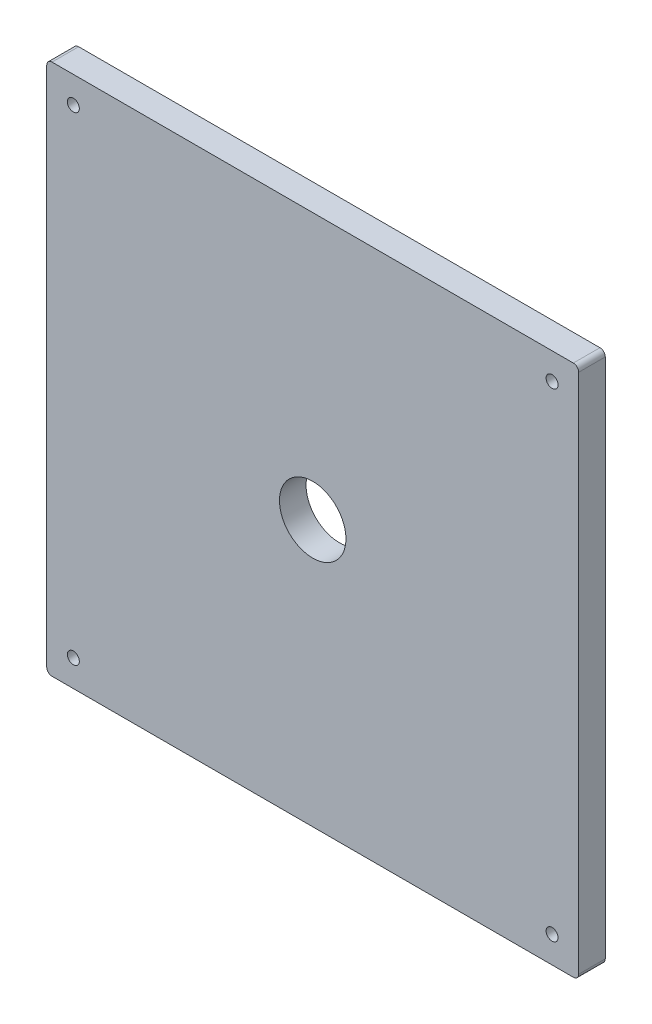
ISO-10303-21;
HEADER;
FILE_DESCRIPTION(('STEP AP214'),'2;1');
FILE_NAME('part.step','',(''),(''),'','','');
FILE_SCHEMA(('AUTOMOTIVE_DESIGN { 1 0 10303 214 1 1 1 1 }'));
ENDSEC;
DATA;
#1=APPLICATION_CONTEXT('core data for automotive mechanical design processes');
#2=APPLICATION_PROTOCOL_DEFINITION('international standard','automotive_design',2000,#1);
#3=PRODUCT_CONTEXT('',#1,'mechanical');
#4=PRODUCT('Part','Part','',(#3));
#5=PRODUCT_RELATED_PRODUCT_CATEGORY('part','',(#4));
#6=PRODUCT_DEFINITION_FORMATION('','',#4);
#7=PRODUCT_DEFINITION_CONTEXT('part definition',#1,'design');
#8=PRODUCT_DEFINITION('design','',#6,#7);
#9=PRODUCT_DEFINITION_SHAPE('','',#8);
#10=(LENGTH_UNIT() NAMED_UNIT(*) SI_UNIT(.MILLI.,.METRE.));
#11=(NAMED_UNIT(*) PLANE_ANGLE_UNIT() SI_UNIT($,.RADIAN.));
#12=(NAMED_UNIT(*) SI_UNIT($,.STERADIAN.) SOLID_ANGLE_UNIT());
#13=UNCERTAINTY_MEASURE_WITH_UNIT(LENGTH_MEASURE(1.E-05),#10,'distance_accuracy_value','');
#14=(GEOMETRIC_REPRESENTATION_CONTEXT(3) GLOBAL_UNCERTAINTY_ASSIGNED_CONTEXT((#13)) GLOBAL_UNIT_ASSIGNED_CONTEXT((#10,
#11,#12)) REPRESENTATION_CONTEXT('',''));
#15=CARTESIAN_POINT('',(0.,0.,0.));
#16=DIRECTION('',(0.,0.,1.));
#17=DIRECTION('',(1.,0.,0.));
#18=AXIS2_PLACEMENT_3D('',#15,#16,#17);
#19=CARTESIAN_POINT('',(-98.,-98.,0.));
#20=DIRECTION('',(0.,0.,-1.));
#21=DIRECTION('',(-1.,0.,0.));
#22=AXIS2_PLACEMENT_3D('',#19,#20,#21);
#23=PLANE('',#22);
#24=CARTESIAN_POINT('',(90.,90.0000000000004,0.));
#25=DIRECTION('',(0.,0.,-1.));
#26=DIRECTION('',(-1.,0.,0.));
#27=AXIS2_PLACEMENT_3D('',#24,#25,#26);
#28=CIRCLE('',#27,4.49999999999999);
#29=CARTESIAN_POINT('',(85.5,90.0000000000004,0.));
#30=VERTEX_POINT('',#29);
#31=EDGE_CURVE('E242',#30,#30,#28,.T.);
#32=ORIENTED_EDGE('',*,*,#31,.F.);
#33=EDGE_LOOP('',(#32));
#34=FACE_BOUND('',#33,.T.);
#35=CARTESIAN_POINT('',(-90.,90.0000000000004,0.));
#36=DIRECTION('',(0.,0.,-1.));
#37=DIRECTION('',(-1.,0.,0.));
#38=AXIS2_PLACEMENT_3D('',#35,#36,#37);
#39=CIRCLE('',#38,4.49999999999999);
#40=CARTESIAN_POINT('',(-94.5,90.0000000000004,0.));
#41=VERTEX_POINT('',#40);
#42=EDGE_CURVE('E230',#41,#41,#39,.T.);
#43=ORIENTED_EDGE('',*,*,#42,.F.);
#44=EDGE_LOOP('',(#43));
#45=FACE_BOUND('',#44,.T.);
#46=CARTESIAN_POINT('',(-90.,-89.9999999999996,0.));
#47=DIRECTION('',(0.,0.,-1.));
#48=DIRECTION('',(-1.,0.,0.));
#49=AXIS2_PLACEMENT_3D('',#46,#47,#48);
#50=CIRCLE('',#49,4.49999999999999);
#51=CARTESIAN_POINT('',(-94.5,-89.9999999999996,0.));
#52=VERTEX_POINT('',#51);
#53=EDGE_CURVE('E218',#52,#52,#50,.T.);
#54=ORIENTED_EDGE('',*,*,#53,.F.);
#55=EDGE_LOOP('',(#54));
#56=FACE_BOUND('',#55,.T.);
#57=CARTESIAN_POINT('',(90.,-89.9999999999996,0.));
#58=DIRECTION('',(0.,0.,-1.));
#59=DIRECTION('',(-1.,0.,0.));
#60=AXIS2_PLACEMENT_3D('',#57,#58,#59);
#61=CIRCLE('',#60,4.49999999999999);
#62=CARTESIAN_POINT('',(85.5,-89.9999999999996,0.));
#63=VERTEX_POINT('',#62);
#64=EDGE_CURVE('E206',#63,#63,#61,.T.);
#65=ORIENTED_EDGE('',*,*,#64,.F.);
#66=EDGE_LOOP('',(#65));
#67=FACE_BOUND('',#66,.T.);
#68=CARTESIAN_POINT('',(0.,0.,0.));
#69=DIRECTION('',(0.,0.,1.));
#70=DIRECTION('',(1.,0.,0.));
#71=AXIS2_PLACEMENT_3D('',#68,#69,#70);
#72=CIRCLE('',#71,12.5);
#73=CARTESIAN_POINT('',(12.5,0.,0.));
#74=VERTEX_POINT('',#73);
#75=EDGE_CURVE('E180',#74,#74,#72,.T.);
#76=ORIENTED_EDGE('',*,*,#75,.T.);
#77=EDGE_LOOP('',(#76));
#78=FACE_BOUND('',#77,.T.);
#79=CARTESIAN_POINT('',(-98.,-98.,0.));
#80=DIRECTION('',(0.,0.,1.));
#81=DIRECTION('',(-1.,0.,0.));
#82=AXIS2_PLACEMENT_3D('',#79,#80,#81);
#83=CIRCLE('',#82,2.);
#84=CARTESIAN_POINT('',(-100.,-98.,0.));
#85=VERTEX_POINT('',#84);
#86=CARTESIAN_POINT('',(-98.,-100.,0.));
#87=VERTEX_POINT('',#86);
#88=EDGE_CURVE('E133',#85,#87,#83,.T.);
#89=ORIENTED_EDGE('',*,*,#88,.F.);
#90=DIRECTION('',(0.,-1.,0.));
#91=VECTOR('',#90,1.);
#92=CARTESIAN_POINT('',(-100.,-98.,0.));
#93=LINE('',#92,#91);
#94=CARTESIAN_POINT('',(-100.,98.,0.));
#95=VERTEX_POINT('',#94);
#96=EDGE_CURVE('E87',#95,#85,#93,.T.);
#97=ORIENTED_EDGE('',*,*,#96,.F.);
#98=CARTESIAN_POINT('',(-98.,98.,0.));
#99=DIRECTION('',(0.,0.,1.));
#100=DIRECTION('',(1.,0.,0.));
#101=AXIS2_PLACEMENT_3D('',#98,#99,#100);
#102=CIRCLE('',#101,1.99999999999999);
#103=CARTESIAN_POINT('',(-98.,100.,0.));
#104=VERTEX_POINT('',#103);
#105=EDGE_CURVE('E81',#104,#95,#102,.T.);
#106=ORIENTED_EDGE('',*,*,#105,.F.);
#107=DIRECTION('',(-1.,0.,0.));
#108=VECTOR('',#107,1.);
#109=CARTESIAN_POINT('',(-98.,100.,0.));
#110=LINE('',#109,#108);
#111=CARTESIAN_POINT('',(98.,100.,0.));
#112=VERTEX_POINT('',#111);
#113=EDGE_CURVE('E123',#112,#104,#110,.T.);
#114=ORIENTED_EDGE('',*,*,#113,.F.);
#115=CARTESIAN_POINT('',(98.,98.,0.));
#116=DIRECTION('',(0.,0.,1.));
#117=DIRECTION('',(1.,0.,0.));
#118=AXIS2_PLACEMENT_3D('',#115,#116,#117);
#119=CIRCLE('',#118,1.99999999999999);
#120=CARTESIAN_POINT('',(100.,98.,0.));
#121=VERTEX_POINT('',#120);
#122=EDGE_CURVE('E143',#121,#112,#119,.T.);
#123=ORIENTED_EDGE('',*,*,#122,.F.);
#124=DIRECTION('',(0.,1.,0.));
#125=VECTOR('',#124,1.);
#126=CARTESIAN_POINT('',(100.,-98.,0.));
#127=LINE('',#126,#125);
#128=CARTESIAN_POINT('',(100.,-98.,0.));
#129=VERTEX_POINT('',#128);
#130=EDGE_CURVE('E141',#129,#121,#127,.T.);
#131=ORIENTED_EDGE('',*,*,#130,.F.);
#132=CARTESIAN_POINT('',(98.,-98.,0.));
#133=DIRECTION('',(0.,0.,1.));
#134=DIRECTION('',(1.,0.,0.));
#135=AXIS2_PLACEMENT_3D('',#132,#133,#134);
#136=CIRCLE('',#135,2.);
#137=CARTESIAN_POINT('',(98.,-100.,0.));
#138=VERTEX_POINT('',#137);
#139=EDGE_CURVE('E139',#138,#129,#136,.T.);
#140=ORIENTED_EDGE('',*,*,#139,.F.);
#141=DIRECTION('',(1.,0.,0.));
#142=VECTOR('',#141,1.);
#143=CARTESIAN_POINT('',(-98.,-100.,0.));
#144=LINE('',#143,#142);
#145=EDGE_CURVE('E136',#87,#138,#144,.T.);
#146=ORIENTED_EDGE('',*,*,#145,.F.);
#147=EDGE_LOOP('',(#89,#97,#106,#114,#123,#131,#140,#146));
#148=FACE_BOUND('',#147,.T.);
#149=ADVANCED_FACE('F35',(#34,#45,#56,#67,#78,#148),#23,.T.);
#150=CARTESIAN_POINT('',(-98.,-98.,10.));
#151=DIRECTION('',(0.,0.,-1.));
#152=DIRECTION('',(-1.,0.,0.));
#153=AXIS2_PLACEMENT_3D('',#150,#151,#152);
#154=PLANE('',#153);
#155=CARTESIAN_POINT('',(-90.,90.0000000000004,10.));
#156=DIRECTION('',(0.,0.,1.));
#157=DIRECTION('',(1.,0.,0.));
#158=AXIS2_PLACEMENT_3D('',#155,#156,#157);
#159=CIRCLE('',#158,2.24999999999999);
#160=CARTESIAN_POINT('',(-87.75,90.0000000000004,10.));
#161=VERTEX_POINT('',#160);
#162=EDGE_CURVE('E194',#161,#161,#159,.T.);
#163=ORIENTED_EDGE('',*,*,#162,.F.);
#164=EDGE_LOOP('',(#163));
#165=FACE_BOUND('',#164,.T.);
#166=CARTESIAN_POINT('',(-90.,-89.9999999999996,10.));
#167=DIRECTION('',(0.,0.,1.));
#168=DIRECTION('',(1.,0.,0.));
#169=AXIS2_PLACEMENT_3D('',#166,#167,#168);
#170=CIRCLE('',#169,2.24999999999999);
#171=CARTESIAN_POINT('',(-87.75,-89.9999999999996,10.));
#172=VERTEX_POINT('',#171);
#173=EDGE_CURVE('E191',#172,#172,#170,.T.);
#174=ORIENTED_EDGE('',*,*,#173,.F.);
#175=EDGE_LOOP('',(#174));
#176=FACE_BOUND('',#175,.T.);
#177=CARTESIAN_POINT('',(90.,-89.9999999999996,10.));
#178=DIRECTION('',(0.,0.,1.));
#179=DIRECTION('',(1.,0.,0.));
#180=AXIS2_PLACEMENT_3D('',#177,#178,#179);
#181=CIRCLE('',#180,2.24999999999999);
#182=CARTESIAN_POINT('',(92.25,-89.9999999999996,10.));
#183=VERTEX_POINT('',#182);
#184=EDGE_CURVE('E188',#183,#183,#181,.T.);
#185=ORIENTED_EDGE('',*,*,#184,.F.);
#186=EDGE_LOOP('',(#185));
#187=FACE_BOUND('',#186,.T.);
#188=CARTESIAN_POINT('',(90.,90.0000000000004,10.));
#189=DIRECTION('',(0.,0.,1.));
#190=DIRECTION('',(1.,0.,0.));
#191=AXIS2_PLACEMENT_3D('',#188,#189,#190);
#192=CIRCLE('',#191,2.24999999999999);
#193=CARTESIAN_POINT('',(92.25,90.0000000000004,10.));
#194=VERTEX_POINT('',#193);
#195=EDGE_CURVE('E183',#194,#194,#192,.T.);
#196=ORIENTED_EDGE('',*,*,#195,.F.);
#197=EDGE_LOOP('',(#196));
#198=FACE_BOUND('',#197,.T.);
#199=CARTESIAN_POINT('',(-98.,-98.,10.));
#200=DIRECTION('',(0.,0.,1.));
#201=DIRECTION('',(-1.,0.,0.));
#202=AXIS2_PLACEMENT_3D('',#199,#200,#201);
#203=CIRCLE('',#202,2.);
#204=CARTESIAN_POINT('',(-100.,-98.,10.));
#205=VERTEX_POINT('',#204);
#206=CARTESIAN_POINT('',(-98.,-100.,10.));
#207=VERTEX_POINT('',#206);
#208=EDGE_CURVE('E148',#205,#207,#203,.T.);
#209=ORIENTED_EDGE('',*,*,#208,.T.);
#210=DIRECTION('',(1.,0.,0.));
#211=VECTOR('',#210,1.);
#212=CARTESIAN_POINT('',(-98.,-100.,10.));
#213=LINE('',#212,#211);
#214=CARTESIAN_POINT('',(98.,-100.,10.));
#215=VERTEX_POINT('',#214);
#216=EDGE_CURVE('E95',#207,#215,#213,.T.);
#217=ORIENTED_EDGE('',*,*,#216,.T.);
#218=CARTESIAN_POINT('',(98.,-98.,10.));
#219=DIRECTION('',(0.,0.,1.));
#220=DIRECTION('',(1.,0.,0.));
#221=AXIS2_PLACEMENT_3D('',#218,#219,#220);
#222=CIRCLE('',#221,2.);
#223=CARTESIAN_POINT('',(100.,-98.,10.));
#224=VERTEX_POINT('',#223);
#225=EDGE_CURVE('E163',#215,#224,#222,.T.);
#226=ORIENTED_EDGE('',*,*,#225,.T.);
#227=DIRECTION('',(0.,1.,0.));
#228=VECTOR('',#227,1.);
#229=CARTESIAN_POINT('',(100.,-98.,10.));
#230=LINE('',#229,#228);
#231=CARTESIAN_POINT('',(100.,98.,10.));
#232=VERTEX_POINT('',#231);
#233=EDGE_CURVE('E174',#224,#232,#230,.T.);
#234=ORIENTED_EDGE('',*,*,#233,.T.);
#235=CARTESIAN_POINT('',(98.,98.,10.));
#236=DIRECTION('',(0.,0.,1.));
#237=DIRECTION('',(1.,0.,0.));
#238=AXIS2_PLACEMENT_3D('',#235,#236,#237);
#239=CIRCLE('',#238,1.99999999999999);
#240=CARTESIAN_POINT('',(98.,100.,10.));
#241=VERTEX_POINT('',#240);
#242=EDGE_CURVE('E115',#232,#241,#239,.T.);
#243=ORIENTED_EDGE('',*,*,#242,.T.);
#244=DIRECTION('',(-1.,0.,0.));
#245=VECTOR('',#244,1.);
#246=CARTESIAN_POINT('',(-98.,100.,10.));
#247=LINE('',#246,#245);
#248=CARTESIAN_POINT('',(-98.,100.,10.));
#249=VERTEX_POINT('',#248);
#250=EDGE_CURVE('E108',#241,#249,#247,.T.);
#251=ORIENTED_EDGE('',*,*,#250,.T.);
#252=CARTESIAN_POINT('',(-98.,98.,10.));
#253=DIRECTION('',(0.,0.,1.));
#254=DIRECTION('',(1.,0.,0.));
#255=AXIS2_PLACEMENT_3D('',#252,#253,#254);
#256=CIRCLE('',#255,1.99999999999999);
#257=CARTESIAN_POINT('',(-100.,98.,10.));
#258=VERTEX_POINT('',#257);
#259=EDGE_CURVE('E113',#249,#258,#256,.T.);
#260=ORIENTED_EDGE('',*,*,#259,.T.);
#261=DIRECTION('',(0.,-1.,0.));
#262=VECTOR('',#261,1.);
#263=CARTESIAN_POINT('',(-100.,-98.,10.));
#264=LINE('',#263,#262);
#265=EDGE_CURVE('E52',#258,#205,#264,.T.);
#266=ORIENTED_EDGE('',*,*,#265,.T.);
#267=EDGE_LOOP('',(#209,#217,#226,#234,#243,#251,#260,#266));
#268=FACE_BOUND('',#267,.T.);
#269=CARTESIAN_POINT('',(0.,0.,10.));
#270=DIRECTION('',(0.,0.,1.));
#271=DIRECTION('',(1.,0.,0.));
#272=AXIS2_PLACEMENT_3D('',#269,#270,#271);
#273=CIRCLE('',#272,12.5);
#274=CARTESIAN_POINT('',(12.5,0.,10.));
#275=VERTEX_POINT('',#274);
#276=EDGE_CURVE('E137',#275,#275,#273,.T.);
#277=ORIENTED_EDGE('',*,*,#276,.F.);
#278=EDGE_LOOP('',(#277));
#279=FACE_BOUND('',#278,.T.);
#280=ADVANCED_FACE('F110',(#165,#176,#187,#198,#268,#279),#154,.F.);
#281=CARTESIAN_POINT('',(-98.,-98.,10.));
#282=DIRECTION('',(0.,0.,-1.));
#283=DIRECTION('',(-1.,0.,0.));
#284=AXIS2_PLACEMENT_3D('',#281,#282,#283);
#285=CYLINDRICAL_SURFACE('',#284,2.);
#286=ORIENTED_EDGE('',*,*,#88,.T.);
#287=DIRECTION('',(0.,0.,-1.));
#288=VECTOR('',#287,1.);
#289=CARTESIAN_POINT('',(-98.,-100.,10.));
#290=LINE('',#289,#288);
#291=EDGE_CURVE('E11',#207,#87,#290,.T.);
#292=ORIENTED_EDGE('',*,*,#291,.F.);
#293=ORIENTED_EDGE('',*,*,#208,.F.);
#294=DIRECTION('',(0.,0.,-1.));
#295=VECTOR('',#294,1.);
#296=CARTESIAN_POINT('',(-100.,-98.,10.));
#297=LINE('',#296,#295);
#298=EDGE_CURVE('E129',#205,#85,#297,.T.);
#299=ORIENTED_EDGE('',*,*,#298,.T.);
#300=EDGE_LOOP('',(#286,#292,#293,#299));
#301=FACE_BOUND('',#300,.T.);
#302=ADVANCED_FACE('F37',(#301),#285,.T.);
#303=CARTESIAN_POINT('',(-98.,-100.,10.));
#304=DIRECTION('',(0.,1.,0.));
#305=DIRECTION('',(0.,0.,1.));
#306=AXIS2_PLACEMENT_3D('',#303,#304,#305);
#307=PLANE('',#306);
#308=ORIENTED_EDGE('',*,*,#145,.T.);
#309=DIRECTION('',(0.,0.,-1.));
#310=VECTOR('',#309,1.);
#311=CARTESIAN_POINT('',(98.,-100.,10.));
#312=LINE('',#311,#310);
#313=EDGE_CURVE('E44',#215,#138,#312,.T.);
#314=ORIENTED_EDGE('',*,*,#313,.F.);
#315=ORIENTED_EDGE('',*,*,#216,.F.);
#316=ORIENTED_EDGE('',*,*,#291,.T.);
#317=EDGE_LOOP('',(#308,#314,#315,#316));
#318=FACE_BOUND('',#317,.T.);
#319=ADVANCED_FACE('F288',(#318),#307,.F.);
#320=CARTESIAN_POINT('',(98.,-98.,10.));
#321=DIRECTION('',(0.,0.,-1.));
#322=DIRECTION('',(-1.,0.,0.));
#323=AXIS2_PLACEMENT_3D('',#320,#321,#322);
#324=CYLINDRICAL_SURFACE('',#323,2.);
#325=ORIENTED_EDGE('',*,*,#139,.T.);
#326=DIRECTION('',(0.,0.,-1.));
#327=VECTOR('',#326,1.);
#328=CARTESIAN_POINT('',(100.,-98.,10.));
#329=LINE('',#328,#327);
#330=EDGE_CURVE('E155',#224,#129,#329,.T.);
#331=ORIENTED_EDGE('',*,*,#330,.F.);
#332=ORIENTED_EDGE('',*,*,#225,.F.);
#333=ORIENTED_EDGE('',*,*,#313,.T.);
#334=EDGE_LOOP('',(#325,#331,#332,#333));
#335=FACE_BOUND('',#334,.T.);
#336=ADVANCED_FACE('F161',(#335),#324,.T.);
#337=CARTESIAN_POINT('',(100.,-98.,10.));
#338=DIRECTION('',(-1.,0.,0.));
#339=DIRECTION('',(0.,0.,1.));
#340=AXIS2_PLACEMENT_3D('',#337,#338,#339);
#341=PLANE('',#340);
#342=ORIENTED_EDGE('',*,*,#130,.T.);
#343=DIRECTION('',(0.,0.,-1.));
#344=VECTOR('',#343,1.);
#345=CARTESIAN_POINT('',(100.,98.,10.));
#346=LINE('',#345,#344);
#347=EDGE_CURVE('E152',#232,#121,#346,.T.);
#348=ORIENTED_EDGE('',*,*,#347,.F.);
#349=ORIENTED_EDGE('',*,*,#233,.F.);
#350=ORIENTED_EDGE('',*,*,#330,.T.);
#351=EDGE_LOOP('',(#342,#348,#349,#350));
#352=FACE_BOUND('',#351,.T.);
#353=ADVANCED_FACE('F170',(#352),#341,.F.);
#354=CARTESIAN_POINT('',(98.,98.,10.));
#355=DIRECTION('',(0.,0.,-1.));
#356=DIRECTION('',(-1.,0.,0.));
#357=AXIS2_PLACEMENT_3D('',#354,#355,#356);
#358=CYLINDRICAL_SURFACE('',#357,1.99999999999999);
#359=ORIENTED_EDGE('',*,*,#122,.T.);
#360=DIRECTION('',(0.,0.,-1.));
#361=VECTOR('',#360,1.);
#362=CARTESIAN_POINT('',(98.,100.,10.));
#363=LINE('',#362,#361);
#364=EDGE_CURVE('E124',#241,#112,#363,.T.);
#365=ORIENTED_EDGE('',*,*,#364,.F.);
#366=ORIENTED_EDGE('',*,*,#242,.F.);
#367=ORIENTED_EDGE('',*,*,#347,.T.);
#368=EDGE_LOOP('',(#359,#365,#366,#367));
#369=FACE_BOUND('',#368,.T.);
#370=ADVANCED_FACE('F173',(#369),#358,.T.);
#371=CARTESIAN_POINT('',(-98.,100.,10.));
#372=DIRECTION('',(0.,-1.,0.));
#373=DIRECTION('',(0.,0.,-1.));
#374=AXIS2_PLACEMENT_3D('',#371,#372,#373);
#375=PLANE('',#374);
#376=ORIENTED_EDGE('',*,*,#113,.T.);
#377=DIRECTION('',(0.,0.,-1.));
#378=VECTOR('',#377,1.);
#379=CARTESIAN_POINT('',(-98.,100.,10.));
#380=LINE('',#379,#378);
#381=EDGE_CURVE('E120',#249,#104,#380,.T.);
#382=ORIENTED_EDGE('',*,*,#381,.F.);
#383=ORIENTED_EDGE('',*,*,#250,.F.);
#384=ORIENTED_EDGE('',*,*,#364,.T.);
#385=EDGE_LOOP('',(#376,#382,#383,#384));
#386=FACE_BOUND('',#385,.T.);
#387=ADVANCED_FACE('F121',(#386),#375,.F.);
#388=CARTESIAN_POINT('',(-98.,98.,10.));
#389=DIRECTION('',(0.,0.,-1.));
#390=DIRECTION('',(-1.,0.,0.));
#391=AXIS2_PLACEMENT_3D('',#388,#389,#390);
#392=CYLINDRICAL_SURFACE('',#391,1.99999999999999);
#393=ORIENTED_EDGE('',*,*,#105,.T.);
#394=DIRECTION('',(0.,0.,-1.));
#395=VECTOR('',#394,1.);
#396=CARTESIAN_POINT('',(-100.,98.,10.));
#397=LINE('',#396,#395);
#398=EDGE_CURVE('E125',#258,#95,#397,.T.);
#399=ORIENTED_EDGE('',*,*,#398,.F.);
#400=ORIENTED_EDGE('',*,*,#259,.F.);
#401=ORIENTED_EDGE('',*,*,#381,.T.);
#402=EDGE_LOOP('',(#393,#399,#400,#401));
#403=FACE_BOUND('',#402,.T.);
#404=ADVANCED_FACE('F127',(#403),#392,.T.);
#405=CARTESIAN_POINT('',(-100.,-98.,10.));
#406=DIRECTION('',(1.,0.,0.));
#407=DIRECTION('',(0.,0.,-1.));
#408=AXIS2_PLACEMENT_3D('',#405,#406,#407);
#409=PLANE('',#408);
#410=ORIENTED_EDGE('',*,*,#96,.T.);
#411=ORIENTED_EDGE('',*,*,#298,.F.);
#412=ORIENTED_EDGE('',*,*,#265,.F.);
#413=ORIENTED_EDGE('',*,*,#398,.T.);
#414=EDGE_LOOP('',(#410,#411,#412,#413));
#415=FACE_BOUND('',#414,.T.);
#416=ADVANCED_FACE('F262',(#415),#409,.F.);
#417=CARTESIAN_POINT('',(0.,0.,10.));
#418=DIRECTION('',(0.,0.,-1.));
#419=DIRECTION('',(-1.,0.,0.));
#420=AXIS2_PLACEMENT_3D('',#417,#418,#419);
#421=CYLINDRICAL_SURFACE('',#420,12.5);
#422=ORIENTED_EDGE('',*,*,#276,.T.);
#423=EDGE_LOOP('',(#422));
#424=FACE_BOUND('',#423,.T.);
#425=ORIENTED_EDGE('',*,*,#75,.F.);
#426=EDGE_LOOP('',(#425));
#427=FACE_BOUND('',#426,.T.);
#428=ADVANCED_FACE('F259',(#424,#427),#421,.F.);
#429=CARTESIAN_POINT('',(90.,90.0000000000004,10.));
#430=DIRECTION('',(0.,0.,1.));
#431=DIRECTION('',(1.,0.,0.));
#432=AXIS2_PLACEMENT_3D('',#429,#430,#431);
#433=CYLINDRICAL_SURFACE('',#432,2.25);
#434=CARTESIAN_POINT('',(90.,90.0000000000004,3.125));
#435=DIRECTION('',(0.,0.,-1.));
#436=DIRECTION('',(-1.,0.,0.));
#437=AXIS2_PLACEMENT_3D('',#434,#435,#436);
#438=CIRCLE('',#437,2.25);
#439=CARTESIAN_POINT('',(87.75,90.0000000000004,3.125));
#440=VERTEX_POINT('',#439);
#441=EDGE_CURVE('E233',#440,#440,#438,.T.);
#442=ORIENTED_EDGE('',*,*,#441,.T.);
#443=EDGE_LOOP('',(#442));
#444=FACE_BOUND('',#443,.T.);
#445=ORIENTED_EDGE('',*,*,#195,.T.);
#446=EDGE_LOOP('',(#445));
#447=FACE_BOUND('',#446,.T.);
#448=ADVANCED_FACE('F261',(#444,#447),#433,.F.);
#449=CARTESIAN_POINT('',(90.,-89.9999999999996,10.));
#450=DIRECTION('',(0.,0.,1.));
#451=DIRECTION('',(1.,0.,0.));
#452=AXIS2_PLACEMENT_3D('',#449,#450,#451);
#453=CYLINDRICAL_SURFACE('',#452,2.25);
#454=CARTESIAN_POINT('',(90.,-89.9999999999996,3.125));
#455=DIRECTION('',(0.,0.,-1.));
#456=DIRECTION('',(-1.,0.,0.));
#457=AXIS2_PLACEMENT_3D('',#454,#455,#456);
#458=CIRCLE('',#457,2.25);
#459=CARTESIAN_POINT('',(87.75,-89.9999999999996,3.125));
#460=VERTEX_POINT('',#459);
#461=EDGE_CURVE('E197',#460,#460,#458,.T.);
#462=ORIENTED_EDGE('',*,*,#461,.T.);
#463=EDGE_LOOP('',(#462));
#464=FACE_BOUND('',#463,.T.);
#465=ORIENTED_EDGE('',*,*,#184,.T.);
#466=EDGE_LOOP('',(#465));
#467=FACE_BOUND('',#466,.T.);
#468=ADVANCED_FACE('F270',(#464,#467),#453,.F.);
#469=CARTESIAN_POINT('',(-90.,-89.9999999999996,10.));
#470=DIRECTION('',(0.,0.,1.));
#471=DIRECTION('',(1.,0.,0.));
#472=AXIS2_PLACEMENT_3D('',#469,#470,#471);
#473=CYLINDRICAL_SURFACE('',#472,2.25);
#474=CARTESIAN_POINT('',(-90.,-89.9999999999996,3.125));
#475=DIRECTION('',(0.,0.,-1.));
#476=DIRECTION('',(-1.,0.,0.));
#477=AXIS2_PLACEMENT_3D('',#474,#475,#476);
#478=CIRCLE('',#477,2.25);
#479=CARTESIAN_POINT('',(-92.25,-89.9999999999996,3.125));
#480=VERTEX_POINT('',#479);
#481=EDGE_CURVE('E209',#480,#480,#478,.T.);
#482=ORIENTED_EDGE('',*,*,#481,.T.);
#483=EDGE_LOOP('',(#482));
#484=FACE_BOUND('',#483,.T.);
#485=ORIENTED_EDGE('',*,*,#173,.T.);
#486=EDGE_LOOP('',(#485));
#487=FACE_BOUND('',#486,.T.);
#488=ADVANCED_FACE('F324',(#484,#487),#473,.F.);
#489=CARTESIAN_POINT('',(-90.,90.0000000000004,10.));
#490=DIRECTION('',(0.,0.,1.));
#491=DIRECTION('',(1.,0.,0.));
#492=AXIS2_PLACEMENT_3D('',#489,#490,#491);
#493=CYLINDRICAL_SURFACE('',#492,2.25);
#494=CARTESIAN_POINT('',(-90.,90.0000000000004,3.125));
#495=DIRECTION('',(0.,0.,-1.));
#496=DIRECTION('',(-1.,0.,0.));
#497=AXIS2_PLACEMENT_3D('',#494,#495,#496);
#498=CIRCLE('',#497,2.25);
#499=CARTESIAN_POINT('',(-92.25,90.0000000000004,3.125));
#500=VERTEX_POINT('',#499);
#501=EDGE_CURVE('E221',#500,#500,#498,.T.);
#502=ORIENTED_EDGE('',*,*,#501,.T.);
#503=EDGE_LOOP('',(#502));
#504=FACE_BOUND('',#503,.T.);
#505=ORIENTED_EDGE('',*,*,#162,.T.);
#506=EDGE_LOOP('',(#505));
#507=FACE_BOUND('',#506,.T.);
#508=ADVANCED_FACE('F333',(#504,#507),#493,.F.);
#509=CARTESIAN_POINT('',(90.,-89.9999999999996,3.1));
#510=DIRECTION('',(0.,0.,-1.));
#511=DIRECTION('',(-1.,0.,0.));
#512=AXIS2_PLACEMENT_3D('',#509,#510,#511);
#513=CONICAL_SURFACE('',#512,2.275,0.785398163397448);
#514=ORIENTED_EDGE('',*,*,#461,.F.);
#515=EDGE_LOOP('',(#514));
#516=FACE_BOUND('',#515,.T.);
#517=CARTESIAN_POINT('',(90.,-89.9999999999996,3.1));
#518=DIRECTION('',(0.,0.,-1.));
#519=DIRECTION('',(-1.,0.,0.));
#520=AXIS2_PLACEMENT_3D('',#517,#518,#519);
#521=CIRCLE('',#520,2.275);
#522=CARTESIAN_POINT('',(87.725,-89.9999999999996,3.1));
#523=VERTEX_POINT('',#522);
#524=EDGE_CURVE('E200',#523,#523,#521,.T.);
#525=ORIENTED_EDGE('',*,*,#524,.T.);
#526=EDGE_LOOP('',(#525));
#527=FACE_BOUND('',#526,.T.);
#528=ADVANCED_FACE('F343',(#516,#527),#513,.F.);
#529=CARTESIAN_POINT('',(92.275,-89.9999999999996,3.1));
#530=DIRECTION('',(0.,0.,1.));
#531=DIRECTION('',(1.,0.,0.));
#532=AXIS2_PLACEMENT_3D('',#529,#530,#531);
#533=PLANE('',#532);
#534=ORIENTED_EDGE('',*,*,#524,.F.);
#535=EDGE_LOOP('',(#534));
#536=FACE_BOUND('',#535,.T.);
#537=CARTESIAN_POINT('',(90.,-89.9999999999996,3.1));
#538=DIRECTION('',(0.,0.,-1.));
#539=DIRECTION('',(-1.,0.,0.));
#540=AXIS2_PLACEMENT_3D('',#537,#538,#539);
#541=CIRCLE('',#540,4.49999999999999);
#542=CARTESIAN_POINT('',(85.5,-89.9999999999996,3.1));
#543=VERTEX_POINT('',#542);
#544=EDGE_CURVE('E203',#543,#543,#541,.T.);
#545=ORIENTED_EDGE('',*,*,#544,.T.);
#546=EDGE_LOOP('',(#545));
#547=FACE_BOUND('',#546,.T.);
#548=ADVANCED_FACE('F353',(#536,#547),#533,.F.);
#549=CARTESIAN_POINT('',(90.,-89.9999999999996,0.));
#550=DIRECTION('',(0.,0.,-1.));
#551=DIRECTION('',(-1.,0.,0.));
#552=AXIS2_PLACEMENT_3D('',#549,#550,#551);
#553=CYLINDRICAL_SURFACE('',#552,4.49999999999999);
#554=ORIENTED_EDGE('',*,*,#544,.F.);
#555=EDGE_LOOP('',(#554));
#556=FACE_BOUND('',#555,.T.);
#557=ORIENTED_EDGE('',*,*,#64,.T.);
#558=EDGE_LOOP('',(#557));
#559=FACE_BOUND('',#558,.T.);
#560=ADVANCED_FACE('F363',(#556,#559),#553,.F.);
#561=CARTESIAN_POINT('',(-90.,-89.9999999999996,3.1));
#562=DIRECTION('',(0.,0.,-1.));
#563=DIRECTION('',(-1.,0.,0.));
#564=AXIS2_PLACEMENT_3D('',#561,#562,#563);
#565=CONICAL_SURFACE('',#564,2.275,0.785398163397448);
#566=ORIENTED_EDGE('',*,*,#481,.F.);
#567=EDGE_LOOP('',(#566));
#568=FACE_BOUND('',#567,.T.);
#569=CARTESIAN_POINT('',(-90.,-89.9999999999996,3.1));
#570=DIRECTION('',(0.,0.,-1.));
#571=DIRECTION('',(-1.,0.,0.));
#572=AXIS2_PLACEMENT_3D('',#569,#570,#571);
#573=CIRCLE('',#572,2.275);
#574=CARTESIAN_POINT('',(-92.275,-89.9999999999996,3.1));
#575=VERTEX_POINT('',#574);
#576=EDGE_CURVE('E212',#575,#575,#573,.T.);
#577=ORIENTED_EDGE('',*,*,#576,.T.);
#578=EDGE_LOOP('',(#577));
#579=FACE_BOUND('',#578,.T.);
#580=ADVANCED_FACE('F373',(#568,#579),#565,.F.);
#581=CARTESIAN_POINT('',(-87.725,-89.9999999999996,3.1));
#582=DIRECTION('',(0.,0.,1.));
#583=DIRECTION('',(1.,0.,0.));
#584=AXIS2_PLACEMENT_3D('',#581,#582,#583);
#585=PLANE('',#584);
#586=ORIENTED_EDGE('',*,*,#576,.F.);
#587=EDGE_LOOP('',(#586));
#588=FACE_BOUND('',#587,.T.);
#589=CARTESIAN_POINT('',(-90.,-89.9999999999996,3.1));
#590=DIRECTION('',(0.,0.,-1.));
#591=DIRECTION('',(-1.,0.,0.));
#592=AXIS2_PLACEMENT_3D('',#589,#590,#591);
#593=CIRCLE('',#592,4.49999999999999);
#594=CARTESIAN_POINT('',(-94.5,-89.9999999999996,3.1));
#595=VERTEX_POINT('',#594);
#596=EDGE_CURVE('E215',#595,#595,#593,.T.);
#597=ORIENTED_EDGE('',*,*,#596,.T.);
#598=EDGE_LOOP('',(#597));
#599=FACE_BOUND('',#598,.T.);
#600=ADVANCED_FACE('F383',(#588,#599),#585,.F.);
#601=CARTESIAN_POINT('',(-90.,-89.9999999999996,0.));
#602=DIRECTION('',(0.,0.,-1.));
#603=DIRECTION('',(-1.,0.,0.));
#604=AXIS2_PLACEMENT_3D('',#601,#602,#603);
#605=CYLINDRICAL_SURFACE('',#604,4.49999999999999);
#606=ORIENTED_EDGE('',*,*,#596,.F.);
#607=EDGE_LOOP('',(#606));
#608=FACE_BOUND('',#607,.T.);
#609=ORIENTED_EDGE('',*,*,#53,.T.);
#610=EDGE_LOOP('',(#609));
#611=FACE_BOUND('',#610,.T.);
#612=ADVANCED_FACE('F393',(#608,#611),#605,.F.);
#613=CARTESIAN_POINT('',(-90.,90.0000000000004,3.1));
#614=DIRECTION('',(0.,0.,-1.));
#615=DIRECTION('',(-1.,0.,0.));
#616=AXIS2_PLACEMENT_3D('',#613,#614,#615);
#617=CONICAL_SURFACE('',#616,2.275,0.785398163397448);
#618=ORIENTED_EDGE('',*,*,#501,.F.);
#619=EDGE_LOOP('',(#618));
#620=FACE_BOUND('',#619,.T.);
#621=CARTESIAN_POINT('',(-90.,90.0000000000004,3.1));
#622=DIRECTION('',(0.,0.,-1.));
#623=DIRECTION('',(-1.,0.,0.));
#624=AXIS2_PLACEMENT_3D('',#621,#622,#623);
#625=CIRCLE('',#624,2.275);
#626=CARTESIAN_POINT('',(-92.275,90.0000000000004,3.1));
#627=VERTEX_POINT('',#626);
#628=EDGE_CURVE('E224',#627,#627,#625,.T.);
#629=ORIENTED_EDGE('',*,*,#628,.T.);
#630=EDGE_LOOP('',(#629));
#631=FACE_BOUND('',#630,.T.);
#632=ADVANCED_FACE('F403',(#620,#631),#617,.F.);
#633=CARTESIAN_POINT('',(-87.725,90.0000000000004,3.1));
#634=DIRECTION('',(0.,0.,1.));
#635=DIRECTION('',(1.,0.,0.));
#636=AXIS2_PLACEMENT_3D('',#633,#634,#635);
#637=PLANE('',#636);
#638=ORIENTED_EDGE('',*,*,#628,.F.);
#639=EDGE_LOOP('',(#638));
#640=FACE_BOUND('',#639,.T.);
#641=CARTESIAN_POINT('',(-90.,90.0000000000004,3.1));
#642=DIRECTION('',(0.,0.,-1.));
#643=DIRECTION('',(-1.,0.,0.));
#644=AXIS2_PLACEMENT_3D('',#641,#642,#643);
#645=CIRCLE('',#644,4.49999999999999);
#646=CARTESIAN_POINT('',(-94.5,90.0000000000004,3.1));
#647=VERTEX_POINT('',#646);
#648=EDGE_CURVE('E227',#647,#647,#645,.T.);
#649=ORIENTED_EDGE('',*,*,#648,.T.);
#650=EDGE_LOOP('',(#649));
#651=FACE_BOUND('',#650,.T.);
#652=ADVANCED_FACE('F413',(#640,#651),#637,.F.);
#653=CARTESIAN_POINT('',(-90.,90.0000000000004,0.));
#654=DIRECTION('',(0.,0.,-1.));
#655=DIRECTION('',(-1.,0.,0.));
#656=AXIS2_PLACEMENT_3D('',#653,#654,#655);
#657=CYLINDRICAL_SURFACE('',#656,4.49999999999999);
#658=ORIENTED_EDGE('',*,*,#648,.F.);
#659=EDGE_LOOP('',(#658));
#660=FACE_BOUND('',#659,.T.);
#661=ORIENTED_EDGE('',*,*,#42,.T.);
#662=EDGE_LOOP('',(#661));
#663=FACE_BOUND('',#662,.T.);
#664=ADVANCED_FACE('F423',(#660,#663),#657,.F.);
#665=CARTESIAN_POINT('',(90.,90.0000000000004,3.1));
#666=DIRECTION('',(0.,0.,-1.));
#667=DIRECTION('',(-1.,0.,0.));
#668=AXIS2_PLACEMENT_3D('',#665,#666,#667);
#669=CONICAL_SURFACE('',#668,2.275,0.785398163397448);
#670=ORIENTED_EDGE('',*,*,#441,.F.);
#671=EDGE_LOOP('',(#670));
#672=FACE_BOUND('',#671,.T.);
#673=CARTESIAN_POINT('',(90.,90.0000000000004,3.1));
#674=DIRECTION('',(0.,0.,-1.));
#675=DIRECTION('',(-1.,0.,0.));
#676=AXIS2_PLACEMENT_3D('',#673,#674,#675);
#677=CIRCLE('',#676,2.275);
#678=CARTESIAN_POINT('',(87.725,90.0000000000004,3.1));
#679=VERTEX_POINT('',#678);
#680=EDGE_CURVE('E236',#679,#679,#677,.T.);
#681=ORIENTED_EDGE('',*,*,#680,.T.);
#682=EDGE_LOOP('',(#681));
#683=FACE_BOUND('',#682,.T.);
#684=ADVANCED_FACE('F433',(#672,#683),#669,.F.);
#685=CARTESIAN_POINT('',(92.275,90.0000000000004,3.1));
#686=DIRECTION('',(0.,0.,1.));
#687=DIRECTION('',(1.,0.,0.));
#688=AXIS2_PLACEMENT_3D('',#685,#686,#687);
#689=PLANE('',#688);
#690=ORIENTED_EDGE('',*,*,#680,.F.);
#691=EDGE_LOOP('',(#690));
#692=FACE_BOUND('',#691,.T.);
#693=CARTESIAN_POINT('',(90.,90.0000000000004,3.1));
#694=DIRECTION('',(0.,0.,-1.));
#695=DIRECTION('',(-1.,0.,0.));
#696=AXIS2_PLACEMENT_3D('',#693,#694,#695);
#697=CIRCLE('',#696,4.49999999999999);
#698=CARTESIAN_POINT('',(85.5,90.0000000000004,3.1));
#699=VERTEX_POINT('',#698);
#700=EDGE_CURVE('E239',#699,#699,#697,.T.);
#701=ORIENTED_EDGE('',*,*,#700,.T.);
#702=EDGE_LOOP('',(#701));
#703=FACE_BOUND('',#702,.T.);
#704=ADVANCED_FACE('F443',(#692,#703),#689,.F.);
#705=CARTESIAN_POINT('',(90.,90.0000000000004,0.));
#706=DIRECTION('',(0.,0.,-1.));
#707=DIRECTION('',(-1.,0.,0.));
#708=AXIS2_PLACEMENT_3D('',#705,#706,#707);
#709=CYLINDRICAL_SURFACE('',#708,4.49999999999999);
#710=ORIENTED_EDGE('',*,*,#700,.F.);
#711=EDGE_LOOP('',(#710));
#712=FACE_BOUND('',#711,.T.);
#713=ORIENTED_EDGE('',*,*,#31,.T.);
#714=EDGE_LOOP('',(#713));
#715=FACE_BOUND('',#714,.T.);
#716=ADVANCED_FACE('F246',(#712,#715),#709,.F.);
#717=CLOSED_SHELL('',(#149,#280,#302,#319,#336,#353,#370,#387,#404,#416,#428,#448,#468,#488,
#508,#528,#548,#560,#580,#600,#612,#632,#652,#664,#684,#704,#716));
#718=MANIFOLD_SOLID_BREP('B2',#717);
#719=ADVANCED_BREP_SHAPE_REPRESENTATION('',(#18,#718),#14);
#720=SHAPE_DEFINITION_REPRESENTATION(#9,#719);
ENDSEC;
END-ISO-10303-21;
